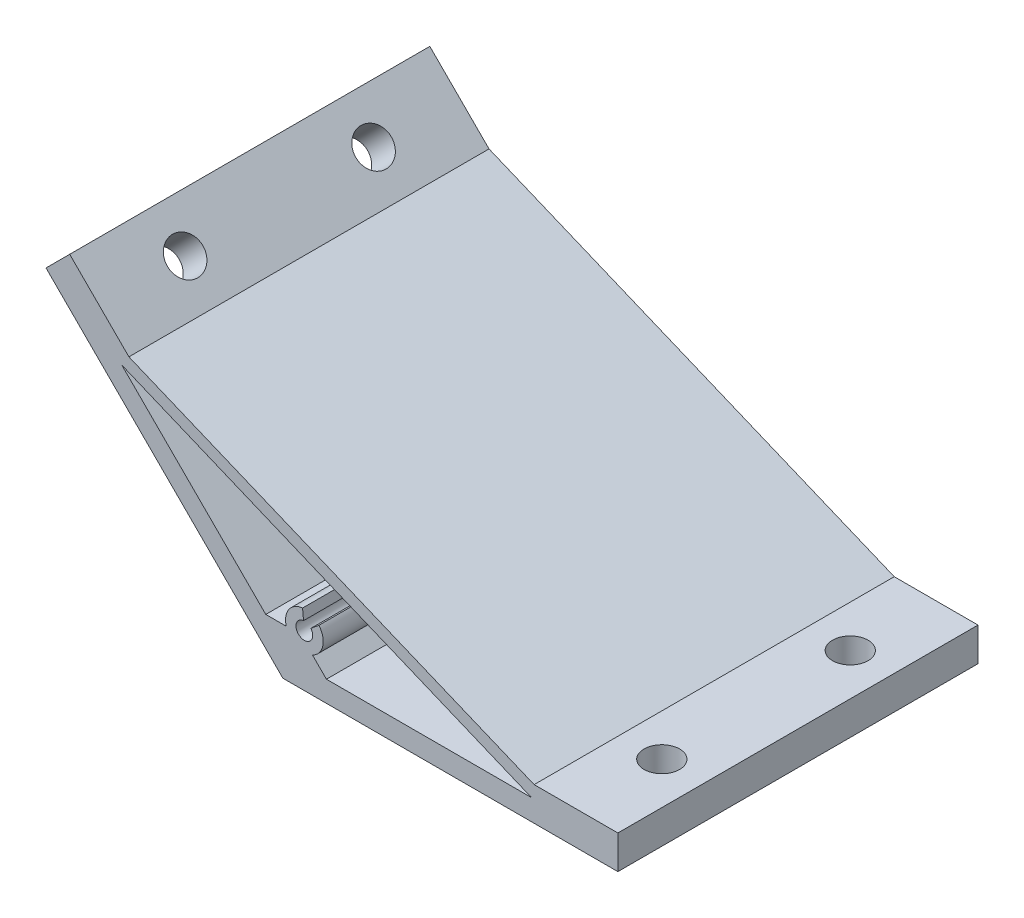
ISO-10303-21;
HEADER;
FILE_DESCRIPTION(('STEP AP214'),'2;1');
FILE_NAME('part.step','',(''),(''),'','','');
FILE_SCHEMA(('AUTOMOTIVE_DESIGN { 1 0 10303 214 1 1 1 1 }'));
ENDSEC;
DATA;
#1=APPLICATION_CONTEXT('core data for automotive mechanical design processes');
#2=APPLICATION_PROTOCOL_DEFINITION('international standard','automotive_design',2000,#1);
#3=PRODUCT_CONTEXT('',#1,'mechanical');
#4=PRODUCT('Part','Part','',(#3));
#5=PRODUCT_RELATED_PRODUCT_CATEGORY('part','',(#4));
#6=PRODUCT_DEFINITION_FORMATION('','',#4);
#7=PRODUCT_DEFINITION_CONTEXT('part definition',#1,'design');
#8=PRODUCT_DEFINITION('design','',#6,#7);
#9=PRODUCT_DEFINITION_SHAPE('','',#8);
#10=(LENGTH_UNIT() NAMED_UNIT(*) SI_UNIT(.MILLI.,.METRE.));
#11=(NAMED_UNIT(*) PLANE_ANGLE_UNIT() SI_UNIT($,.RADIAN.));
#12=(NAMED_UNIT(*) SI_UNIT($,.STERADIAN.) SOLID_ANGLE_UNIT());
#13=UNCERTAINTY_MEASURE_WITH_UNIT(LENGTH_MEASURE(1.E-05),#10,'distance_accuracy_value','');
#14=(GEOMETRIC_REPRESENTATION_CONTEXT(3) GLOBAL_UNCERTAINTY_ASSIGNED_CONTEXT((#13)) GLOBAL_UNIT_ASSIGNED_CONTEXT((#10,
#11,#12)) REPRESENTATION_CONTEXT('',''));
#15=CARTESIAN_POINT('',(0.,0.,0.));
#16=DIRECTION('',(0.,0.,1.));
#17=DIRECTION('',(1.,0.,0.));
#18=AXIS2_PLACEMENT_3D('',#15,#16,#17);
#19=CARTESIAN_POINT('',(580.06230191566,1400.39427630612,43.));
#20=DIRECTION('',(0.382683432365095,0.923879532511285,0.));
#21=DIRECTION('',(-0.923879532511285,0.382683432365095,0.));
#22=AXIS2_PLACEMENT_3D('',#19,#20,#21);
#23=PLANE('',#22);
#24=DIRECTION('',(0.923879532511285,-0.382683432365095,0.));
#25=VECTOR('',#24,1.);
#26=CARTESIAN_POINT('',(580.06230191566,1400.39427630612,-43.));
#27=LINE('',#26,#25);
#28=CARTESIAN_POINT('',(6955.91811216156,-1240.57167203307,-43.));
#29=VERTEX_POINT('',#28);
#30=CARTESIAN_POINT('',(7052.68766478326,-1280.65493315376,-43.));
#31=VERTEX_POINT('',#30);
#32=EDGE_CURVE('E233',#29,#31,#27,.T.);
#33=ORIENTED_EDGE('',*,*,#32,.F.);
#34=DIRECTION('',(0.,0.,-1.));
#35=VECTOR('',#34,1.);
#36=CARTESIAN_POINT('',(6955.91811216156,-1240.57167203307,43.));
#37=LINE('',#36,#35);
#38=CARTESIAN_POINT('',(6955.91811216156,-1240.57167203307,43.));
#39=VERTEX_POINT('',#38);
#40=EDGE_CURVE('E11',#39,#29,#37,.T.);
#41=ORIENTED_EDGE('',*,*,#40,.F.);
#42=DIRECTION('',(0.923879532511285,-0.382683432365095,0.));
#43=VECTOR('',#42,1.);
#44=CARTESIAN_POINT('',(580.06230191566,1400.39427630612,43.));
#45=LINE('',#44,#43);
#46=CARTESIAN_POINT('',(7052.68766478326,-1280.65493315376,43.));
#47=VERTEX_POINT('',#46);
#48=EDGE_CURVE('E270',#39,#47,#45,.T.);
#49=ORIENTED_EDGE('',*,*,#48,.T.);
#50=DIRECTION('',(0.,0.,-1.));
#51=VECTOR('',#50,1.);
#52=CARTESIAN_POINT('',(7052.68766478326,-1280.65493315376,43.));
#53=LINE('',#52,#51);
#54=EDGE_CURVE('E54',#47,#31,#53,.T.);
#55=ORIENTED_EDGE('',*,*,#54,.T.);
#56=EDGE_LOOP('',(#33,#41,#49,#55));
#57=FACE_BOUND('',#56,.T.);
#58=ADVANCED_FACE('F35',(#57),#23,.T.);
#59=CARTESIAN_POINT('',(2857.67322006435,2857.67322006426,43.));
#60=DIRECTION('',(-0.707106781186559,-0.707106781186536,0.));
#61=DIRECTION('',(0.707106781186536,-0.707106781186559,0.));
#62=AXIS2_PLACEMENT_3D('',#59,#60,#61);
#63=PLANE('',#62);
#64=CARTESIAN_POINT('',(6948.84704434969,-1233.50060422121,-22.5));
#65=DIRECTION('',(-0.707106781186559,-0.707106781186536,0.));
#66=DIRECTION('',(0.707106781186536,-0.707106781186559,0.));
#67=AXIS2_PLACEMENT_3D('',#64,#65,#66);
#68=CIRCLE('',#67,4.24999999999998);
#69=CARTESIAN_POINT('',(6951.85224816974,-1236.50580804125,-22.5));
#70=VERTEX_POINT('',#69);
#71=EDGE_CURVE('E299',#70,#70,#68,.T.);
#72=ORIENTED_EDGE('',*,*,#71,.T.);
#73=EDGE_LOOP('',(#72));
#74=FACE_BOUND('',#73,.T.);
#75=CARTESIAN_POINT('',(6948.84704434969,-1233.50060422121,22.5));
#76=DIRECTION('',(-0.707106781186559,-0.707106781186536,0.));
#77=DIRECTION('',(0.707106781186536,-0.707106781186559,0.));
#78=AXIS2_PLACEMENT_3D('',#75,#76,#77);
#79=CIRCLE('',#78,4.24999999999998);
#80=CARTESIAN_POINT('',(6951.85224816974,-1236.50580804125,22.5));
#81=VERTEX_POINT('',#80);
#82=EDGE_CURVE('E262',#81,#81,#79,.T.);
#83=ORIENTED_EDGE('',*,*,#82,.T.);
#84=EDGE_LOOP('',(#83));
#85=FACE_BOUND('',#84,.T.);
#86=DIRECTION('',(-0.707106781186536,0.707106781186559,0.));
#87=VECTOR('',#86,1.);
#88=CARTESIAN_POINT('',(2857.67322006435,2857.67322006426,-43.));
#89=LINE('',#88,#87);
#90=CARTESIAN_POINT('',(6941.77597653783,-1226.42953640934,-43.));
#91=VERTEX_POINT('',#90);
#92=EDGE_CURVE('E230',#29,#91,#89,.T.);
#93=ORIENTED_EDGE('',*,*,#92,.T.);
#94=DIRECTION('',(0.,0.,-1.));
#95=VECTOR('',#94,1.);
#96=CARTESIAN_POINT('',(6941.77597653783,-1226.42953640934,43.));
#97=LINE('',#96,#95);
#98=CARTESIAN_POINT('',(6941.77597653783,-1226.42953640934,43.));
#99=VERTEX_POINT('',#98);
#100=EDGE_CURVE('E45',#99,#91,#97,.T.);
#101=ORIENTED_EDGE('',*,*,#100,.F.);
#102=DIRECTION('',(-0.707106781186536,0.707106781186559,0.));
#103=VECTOR('',#102,1.);
#104=CARTESIAN_POINT('',(2857.67322006435,2857.67322006426,43.));
#105=LINE('',#104,#103);
#106=EDGE_CURVE('E268',#39,#99,#105,.T.);
#107=ORIENTED_EDGE('',*,*,#106,.F.);
#108=ORIENTED_EDGE('',*,*,#40,.T.);
#109=EDGE_LOOP('',(#93,#101,#107,#108));
#110=FACE_BOUND('',#109,.T.);
#111=ADVANCED_FACE('F332',(#74,#85,#110),#63,.F.);
#112=CARTESIAN_POINT('',(4084.10275647372,-4084.10275647356,43.));
#113=DIRECTION('',(-0.707106781186561,0.707106781186534,0.));
#114=DIRECTION('',(-0.707106781186534,-0.707106781186561,0.));
#115=AXIS2_PLACEMENT_3D('',#112,#113,#114);
#116=PLANE('',#115);
#117=DIRECTION('',(0.707106781186534,0.707106781186561,0.));
#118=VECTOR('',#117,1.);
#119=CARTESIAN_POINT('',(4084.10275647372,-4084.10275647356,-43.));
#120=LINE('',#119,#118);
#121=CARTESIAN_POINT('',(6936.11912228834,-1232.08639065884,-43.));
#122=VERTEX_POINT('',#121);
#123=EDGE_CURVE('E227',#122,#91,#120,.T.);
#124=ORIENTED_EDGE('',*,*,#123,.F.);
#125=DIRECTION('',(0.,0.,-1.));
#126=VECTOR('',#125,1.);
#127=CARTESIAN_POINT('',(6936.11912228834,-1232.08639065884,43.));
#128=LINE('',#127,#126);
#129=CARTESIAN_POINT('',(6936.11912228834,-1232.08639065884,43.));
#130=VERTEX_POINT('',#129);
#131=EDGE_CURVE('E187',#130,#122,#128,.T.);
#132=ORIENTED_EDGE('',*,*,#131,.F.);
#133=DIRECTION('',(0.707106781186534,0.707106781186561,0.));
#134=VECTOR('',#133,1.);
#135=CARTESIAN_POINT('',(4084.10275647372,-4084.10275647356,43.));
#136=LINE('',#135,#134);
#137=EDGE_CURVE('E265',#130,#99,#136,.T.);
#138=ORIENTED_EDGE('',*,*,#137,.T.);
#139=ORIENTED_EDGE('',*,*,#100,.T.);
#140=EDGE_LOOP('',(#124,#132,#138,#139));
#141=FACE_BOUND('',#140,.T.);
#142=ADVANCED_FACE('F338',(#141),#116,.T.);
#143=CARTESIAN_POINT('',(2852.0163658146,2852.01636581472,43.));
#144=DIRECTION('',(-0.707106781186532,-0.707106781186563,0.));
#145=DIRECTION('',(0.707106781186563,-0.707106781186532,0.));
#146=AXIS2_PLACEMENT_3D('',#143,#144,#145);
#147=PLANE('',#146);
#148=CARTESIAN_POINT('',(6943.1901901002,-1239.1574584707,-22.5));
#149=DIRECTION('',(-0.707106781186532,-0.707106781186563,0.));
#150=DIRECTION('',(0.707106781186563,-0.707106781186532,0.));
#151=AXIS2_PLACEMENT_3D('',#148,#149,#150);
#152=CIRCLE('',#151,4.24999999999999);
#153=CARTESIAN_POINT('',(6946.19539392024,-1242.16266229074,-22.5));
#154=VERTEX_POINT('',#153);
#155=EDGE_CURVE('E302',#154,#154,#152,.T.);
#156=ORIENTED_EDGE('',*,*,#155,.F.);
#157=EDGE_LOOP('',(#156));
#158=FACE_BOUND('',#157,.T.);
#159=CARTESIAN_POINT('',(6943.1901901002,-1239.1574584707,22.5));
#160=DIRECTION('',(-0.707106781186532,-0.707106781186563,0.));
#161=DIRECTION('',(0.707106781186563,-0.707106781186532,0.));
#162=AXIS2_PLACEMENT_3D('',#159,#160,#161);
#163=CIRCLE('',#162,4.24999999999999);
#164=CARTESIAN_POINT('',(6946.19539392024,-1242.16266229074,22.5));
#165=VERTEX_POINT('',#164);
#166=EDGE_CURVE('E296',#165,#165,#163,.T.);
#167=ORIENTED_EDGE('',*,*,#166,.F.);
#168=EDGE_LOOP('',(#167));
#169=FACE_BOUND('',#168,.T.);
#170=DIRECTION('',(-0.707106781186563,0.707106781186532,0.));
#171=VECTOR('',#170,1.);
#172=CARTESIAN_POINT('',(2852.0163658146,2852.01636581472,-43.));
#173=LINE('',#172,#171);
#174=CARTESIAN_POINT('',(6992.68766478326,-1288.65493315376,-43.));
#175=VERTEX_POINT('',#174);
#176=EDGE_CURVE('E224',#175,#122,#173,.T.);
#177=ORIENTED_EDGE('',*,*,#176,.F.);
#178=DIRECTION('',(0.,0.,-1.));
#179=VECTOR('',#178,1.);
#180=CARTESIAN_POINT('',(6992.68766478326,-1288.65493315376,43.));
#181=LINE('',#180,#179);
#182=CARTESIAN_POINT('',(6992.68766478326,-1288.65493315376,43.));
#183=VERTEX_POINT('',#182);
#184=EDGE_CURVE('E185',#183,#175,#181,.T.);
#185=ORIENTED_EDGE('',*,*,#184,.F.);
#186=DIRECTION('',(-0.707106781186563,0.707106781186532,0.));
#187=VECTOR('',#186,1.);
#188=CARTESIAN_POINT('',(2852.0163658146,2852.01636581472,43.));
#189=LINE('',#188,#187);
#190=EDGE_CURVE('E179',#183,#130,#189,.T.);
#191=ORIENTED_EDGE('',*,*,#190,.T.);
#192=ORIENTED_EDGE('',*,*,#131,.T.);
#193=EDGE_LOOP('',(#177,#185,#191,#192));
#194=FACE_BOUND('',#193,.T.);
#195=ADVANCED_FACE('F336',(#158,#169,#194),#147,.T.);
#196=CARTESIAN_POINT('',(0.,-1288.65493315376,43.));
#197=DIRECTION('',(0.,1.,0.));
#198=DIRECTION('',(0.,0.,1.));
#199=AXIS2_PLACEMENT_3D('',#196,#197,#198);
#200=PLANE('',#199);
#201=CARTESIAN_POINT('',(7062.68766478326,-1288.65493315377,-22.5));
#202=DIRECTION('',(0.,-1.,0.));
#203=DIRECTION('',(0.,0.,-1.));
#204=AXIS2_PLACEMENT_3D('',#201,#202,#203);
#205=CIRCLE('',#204,4.24999999999986);
#206=CARTESIAN_POINT('',(7062.68766478326,-1288.65493315377,-26.7499999999999));
#207=VERTEX_POINT('',#206);
#208=EDGE_CURVE('E311',#207,#207,#205,.T.);
#209=ORIENTED_EDGE('',*,*,#208,.F.);
#210=EDGE_LOOP('',(#209));
#211=FACE_BOUND('',#210,.T.);
#212=CARTESIAN_POINT('',(7062.68766478326,-1288.65493315377,22.5));
#213=DIRECTION('',(0.,-1.,0.));
#214=DIRECTION('',(0.,0.,-1.));
#215=AXIS2_PLACEMENT_3D('',#212,#213,#214);
#216=CIRCLE('',#215,4.24999999999986);
#217=CARTESIAN_POINT('',(7062.68766478326,-1288.65493315377,18.2500000000001));
#218=VERTEX_POINT('',#217);
#219=EDGE_CURVE('E308',#218,#218,#216,.T.);
#220=ORIENTED_EDGE('',*,*,#219,.F.);
#221=EDGE_LOOP('',(#220));
#222=FACE_BOUND('',#221,.T.);
#223=DIRECTION('',(1.,0.,0.));
#224=VECTOR('',#223,1.);
#225=CARTESIAN_POINT('',(0.,-1288.65493315376,-43.));
#226=LINE('',#225,#224);
#227=CARTESIAN_POINT('',(7072.68766478326,-1288.65493315376,-43.));
#228=VERTEX_POINT('',#227);
#229=EDGE_CURVE('E184',#175,#228,#226,.T.);
#230=ORIENTED_EDGE('',*,*,#229,.T.);
#231=DIRECTION('',(0.,0.,-1.));
#232=VECTOR('',#231,1.);
#233=CARTESIAN_POINT('',(7072.68766478326,-1288.65493315376,43.));
#234=LINE('',#233,#232);
#235=CARTESIAN_POINT('',(7072.68766478326,-1288.65493315376,43.));
#236=VERTEX_POINT('',#235);
#237=EDGE_CURVE('E166',#236,#228,#234,.T.);
#238=ORIENTED_EDGE('',*,*,#237,.F.);
#239=DIRECTION('',(1.,0.,0.));
#240=VECTOR('',#239,1.);
#241=CARTESIAN_POINT('',(0.,-1288.65493315376,43.));
#242=LINE('',#241,#240);
#243=EDGE_CURVE('E171',#183,#236,#242,.T.);
#244=ORIENTED_EDGE('',*,*,#243,.F.);
#245=ORIENTED_EDGE('',*,*,#184,.T.);
#246=EDGE_LOOP('',(#230,#238,#244,#245));
#247=FACE_BOUND('',#246,.T.);
#248=ADVANCED_FACE('F182',(#211,#222,#247),#200,.F.);
#249=CARTESIAN_POINT('',(7072.68766478326,0.,43.));
#250=DIRECTION('',(-1.,0.,0.));
#251=DIRECTION('',(0.,0.,1.));
#252=AXIS2_PLACEMENT_3D('',#249,#250,#251);
#253=PLANE('',#252);
#254=DIRECTION('',(0.,1.,0.));
#255=VECTOR('',#254,1.);
#256=CARTESIAN_POINT('',(7072.68766478326,0.,-43.));
#257=LINE('',#256,#255);
#258=CARTESIAN_POINT('',(7072.68766478326,-1280.65493315376,-43.));
#259=VERTEX_POINT('',#258);
#260=EDGE_CURVE('E221',#228,#259,#257,.T.);
#261=ORIENTED_EDGE('',*,*,#260,.T.);
#262=DIRECTION('',(0.,0.,-1.));
#263=VECTOR('',#262,1.);
#264=CARTESIAN_POINT('',(7072.68766478326,-1280.65493315376,43.));
#265=LINE('',#264,#263);
#266=CARTESIAN_POINT('',(7072.68766478326,-1280.65493315376,43.));
#267=VERTEX_POINT('',#266);
#268=EDGE_CURVE('E107',#267,#259,#265,.T.);
#269=ORIENTED_EDGE('',*,*,#268,.F.);
#270=DIRECTION('',(0.,1.,0.));
#271=VECTOR('',#270,1.);
#272=CARTESIAN_POINT('',(7072.68766478326,0.,43.));
#273=LINE('',#272,#271);
#274=EDGE_CURVE('E162',#236,#267,#273,.T.);
#275=ORIENTED_EDGE('',*,*,#274,.F.);
#276=ORIENTED_EDGE('',*,*,#237,.T.);
#277=EDGE_LOOP('',(#261,#269,#275,#276));
#278=FACE_BOUND('',#277,.T.);
#279=ADVANCED_FACE('F164',(#278),#253,.F.);
#280=CARTESIAN_POINT('',(6997.82073881189,-1276.26412007604,43.));
#281=DIRECTION('',(0.,0.,-1.));
#282=DIRECTION('',(-1.,0.,0.));
#283=AXIS2_PLACEMENT_3D('',#280,#281,#282);
#284=CYLINDRICAL_SURFACE('',#283,1.99999999999993);
#285=CARTESIAN_POINT('',(6997.82073881189,-1276.26412007604,-43.));
#286=DIRECTION('',(0.,0.,1.));
#287=DIRECTION('',(1.,0.,0.));
#288=AXIS2_PLACEMENT_3D('',#285,#286,#287);
#289=CIRCLE('',#288,1.99999999999993);
#290=CARTESIAN_POINT('',(6997.62653003943,-1274.27357167103,-43.));
#291=VERTEX_POINT('',#290);
#292=CARTESIAN_POINT('',(6999.36559542733,-1274.99391614055,-43.));
#293=VERTEX_POINT('',#292);
#294=EDGE_CURVE('E259',#291,#293,#289,.T.);
#295=ORIENTED_EDGE('',*,*,#294,.F.);
#296=DIRECTION('',(0.,0.,-1.));
#297=VECTOR('',#296,1.);
#298=CARTESIAN_POINT('',(6997.62653003943,-1274.27357167103,43.));
#299=LINE('',#298,#297);
#300=CARTESIAN_POINT('',(6997.62653003943,-1274.27357167103,43.));
#301=VERTEX_POINT('',#300);
#302=EDGE_CURVE('E119',#301,#291,#299,.T.);
#303=ORIENTED_EDGE('',*,*,#302,.F.);
#304=CARTESIAN_POINT('',(6997.82073881189,-1276.26412007604,43.));
#305=DIRECTION('',(0.,0.,1.));
#306=DIRECTION('',(1.,0.,0.));
#307=AXIS2_PLACEMENT_3D('',#304,#305,#306);
#308=CIRCLE('',#307,1.99999999999993);
#309=CARTESIAN_POINT('',(6999.36559542733,-1274.99391614055,43.));
#310=VERTEX_POINT('',#309);
#311=EDGE_CURVE('E220',#301,#310,#308,.T.);
#312=ORIENTED_EDGE('',*,*,#311,.T.);
#313=DIRECTION('',(0.,0.,-1.));
#314=VECTOR('',#313,1.);
#315=CARTESIAN_POINT('',(6999.36559542733,-1274.99391614055,43.));
#316=LINE('',#315,#314);
#317=EDGE_CURVE('E194',#310,#293,#316,.T.);
#318=ORIENTED_EDGE('',*,*,#317,.T.);
#319=EDGE_LOOP('',(#295,#303,#312,#318));
#320=FACE_BOUND('',#319,.T.);
#321=ADVANCED_FACE('F37',(#320),#284,.F.);
#322=CARTESIAN_POINT('',(6808.49128288336,664.273589646761,43.));
#323=DIRECTION('',(-0.9952742025064,-0.0971043862307417,0.));
#324=DIRECTION('',(0.0971043862307417,-0.9952742025064,0.));
#325=AXIS2_PLACEMENT_3D('',#322,#323,#324);
#326=PLANE('',#325);
#327=DIRECTION('',(-0.0971043862307417,0.9952742025064,0.));
#328=VECTOR('',#327,1.);
#329=CARTESIAN_POINT('',(6808.49128288336,664.273589646761,-43.));
#330=LINE('',#329,#328);
#331=CARTESIAN_POINT('',(6997.38376907385,-1271.78538616476,-43.));
#332=VERTEX_POINT('',#331);
#333=EDGE_CURVE('E257',#291,#332,#330,.T.);
#334=ORIENTED_EDGE('',*,*,#333,.T.);
#335=DIRECTION('',(0.,0.,-1.));
#336=VECTOR('',#335,1.);
#337=CARTESIAN_POINT('',(6997.38376907385,-1271.78538616476,43.));
#338=LINE('',#337,#336);
#339=CARTESIAN_POINT('',(6997.38376907385,-1271.78538616476,43.));
#340=VERTEX_POINT('',#339);
#341=EDGE_CURVE('E212',#340,#332,#338,.T.);
#342=ORIENTED_EDGE('',*,*,#341,.F.);
#343=DIRECTION('',(-0.0971043862307417,0.9952742025064,0.));
#344=VECTOR('',#343,1.);
#345=CARTESIAN_POINT('',(6808.49128288336,664.273589646761,43.));
#346=LINE('',#345,#344);
#347=EDGE_CURVE('E291',#301,#340,#346,.T.);
#348=ORIENTED_EDGE('',*,*,#347,.F.);
#349=ORIENTED_EDGE('',*,*,#302,.T.);
#350=EDGE_LOOP('',(#334,#342,#348,#349));
#351=FACE_BOUND('',#350,.T.);
#352=ADVANCED_FACE('F383',(#351),#326,.F.);
#353=CARTESIAN_POINT('',(6997.82073881189,-1276.26412007604,43.));
#354=DIRECTION('',(0.,0.,-1.));
#355=DIRECTION('',(-1.,0.,0.));
#356=AXIS2_PLACEMENT_3D('',#353,#354,#355);
#357=CYLINDRICAL_SURFACE('',#356,4.49999999999951);
#358=CARTESIAN_POINT('',(6997.82073881189,-1276.26412007604,-43.));
#359=DIRECTION('',(0.,0.,1.));
#360=DIRECTION('',(1.,0.,0.));
#361=AXIS2_PLACEMENT_3D('',#358,#359,#360);
#362=CIRCLE('',#361,4.49999999999951);
#363=CARTESIAN_POINT('',(6993.49338103034,-1277.49861374974,-43.));
#364=VERTEX_POINT('',#363);
#365=EDGE_CURVE('E254',#332,#364,#362,.T.);
#366=ORIENTED_EDGE('',*,*,#365,.T.);
#367=DIRECTION('',(0.,0.,-1.));
#368=VECTOR('',#367,1.);
#369=CARTESIAN_POINT('',(6993.49338103034,-1277.49861374974,43.));
#370=LINE('',#369,#368);
#371=CARTESIAN_POINT('',(6993.49338103034,-1277.49861374974,43.));
#372=VERTEX_POINT('',#371);
#373=EDGE_CURVE('E210',#372,#364,#370,.T.);
#374=ORIENTED_EDGE('',*,*,#373,.F.);
#375=CARTESIAN_POINT('',(6997.82073881189,-1276.26412007604,43.));
#376=DIRECTION('',(0.,0.,1.));
#377=DIRECTION('',(1.,0.,0.));
#378=AXIS2_PLACEMENT_3D('',#375,#376,#377);
#379=CIRCLE('',#378,4.49999999999951);
#380=EDGE_CURVE('E289',#340,#372,#379,.T.);
#381=ORIENTED_EDGE('',*,*,#380,.F.);
#382=ORIENTED_EDGE('',*,*,#341,.T.);
#383=EDGE_LOOP('',(#366,#374,#381,#382));
#384=FACE_BOUND('',#383,.T.);
#385=ADVANCED_FACE('F380',(#384),#357,.T.);
#386=CARTESIAN_POINT('',(1.15994087185971E-09,-1277.49861375609,43.));
#387=DIRECTION('',(-9.079781843749E-13,1.,0.));
#388=DIRECTION('',(-1.,-9.079781843749E-13,0.));
#389=AXIS2_PLACEMENT_3D('',#386,#387,#388);
#390=PLANE('',#389);
#391=DIRECTION('',(1.,9.079781843749E-13,0.));
#392=VECTOR('',#391,1.);
#393=CARTESIAN_POINT('',(1.15994087185971E-09,-1277.49861375609,-43.));
#394=LINE('',#393,#392);
#395=CARTESIAN_POINT('',(6988.60241319111,-1277.49861374974,-43.));
#396=VERTEX_POINT('',#395);
#397=EDGE_CURVE('E251',#396,#364,#394,.T.);
#398=ORIENTED_EDGE('',*,*,#397,.F.);
#399=DIRECTION('',(0.,0.,-1.));
#400=VECTOR('',#399,1.);
#401=CARTESIAN_POINT('',(6988.60241319111,-1277.49861374974,43.));
#402=LINE('',#401,#400);
#403=CARTESIAN_POINT('',(6988.60241319111,-1277.49861374974,43.));
#404=VERTEX_POINT('',#403);
#405=EDGE_CURVE('E208',#404,#396,#402,.T.);
#406=ORIENTED_EDGE('',*,*,#405,.F.);
#407=DIRECTION('',(1.,9.079781843749E-13,0.));
#408=VECTOR('',#407,1.);
#409=CARTESIAN_POINT('',(1.15994087185971E-09,-1277.49861375609,43.));
#410=LINE('',#409,#408);
#411=EDGE_CURVE('E286',#404,#372,#410,.T.);
#412=ORIENTED_EDGE('',*,*,#411,.T.);
#413=ORIENTED_EDGE('',*,*,#373,.T.);
#414=EDGE_LOOP('',(#398,#406,#412,#413));
#415=FACE_BOUND('',#414,.T.);
#416=ADVANCED_FACE('F376',(#415),#390,.T.);
#417=CARTESIAN_POINT('',(2855.55189972073,2855.55189972069,43.));
#418=DIRECTION('',(-0.707106781186552,-0.707106781186543,0.));
#419=DIRECTION('',(0.707106781186543,-0.707106781186552,0.));
#420=AXIS2_PLACEMENT_3D('',#417,#418,#419);
#421=PLANE('',#420);
#422=DIRECTION('',(-0.707106781186543,0.707106781186552,0.));
#423=VECTOR('',#422,1.);
#424=CARTESIAN_POINT('',(2855.55189972073,2855.55189972069,-43.));
#425=LINE('',#424,#423);
#426=CARTESIAN_POINT('',(6954.21874866951,-1243.11494922814,-43.));
#427=VERTEX_POINT('',#426);
#428=EDGE_CURVE('E249',#396,#427,#425,.T.);
#429=ORIENTED_EDGE('',*,*,#428,.T.);
#430=DIRECTION('',(0.,0.,-1.));
#431=VECTOR('',#430,1.);
#432=CARTESIAN_POINT('',(6954.21874866951,-1243.11494922814,43.));
#433=LINE('',#432,#431);
#434=CARTESIAN_POINT('',(6954.21874866951,-1243.11494922814,43.));
#435=VERTEX_POINT('',#434);
#436=EDGE_CURVE('E205',#435,#427,#433,.T.);
#437=ORIENTED_EDGE('',*,*,#436,.F.);
#438=DIRECTION('',(-0.707106781186543,0.707106781186552,0.));
#439=VECTOR('',#438,1.);
#440=CARTESIAN_POINT('',(2855.55189972073,2855.55189972069,43.));
#441=LINE('',#440,#439);
#442=EDGE_CURVE('E284',#404,#435,#441,.T.);
#443=ORIENTED_EDGE('',*,*,#442,.F.);
#444=ORIENTED_EDGE('',*,*,#405,.T.);
#445=EDGE_LOOP('',(#429,#437,#443,#444));
#446=FACE_BOUND('',#445,.T.);
#447=ADVANCED_FACE('F372',(#446),#421,.F.);
#448=CARTESIAN_POINT('',(578.914251618586,1397.62263770862,43.));
#449=DIRECTION('',(0.3826834323651,0.923879532511283,0.));
#450=DIRECTION('',(-0.923879532511283,0.3826834323651,0.));
#451=AXIS2_PLACEMENT_3D('',#448,#449,#450);
#452=PLANE('',#451);
#453=DIRECTION('',(0.923879532511283,-0.3826834323651,0.));
#454=VECTOR('',#453,1.);
#455=CARTESIAN_POINT('',(578.914251618586,1397.62263770862,-43.));
#456=LINE('',#455,#454);
#457=CARTESIAN_POINT('',(7052.09092768112,-1283.65493315376,-43.));
#458=VERTEX_POINT('',#457);
#459=EDGE_CURVE('E246',#427,#458,#456,.T.);
#460=ORIENTED_EDGE('',*,*,#459,.T.);
#461=DIRECTION('',(0.,0.,-1.));
#462=VECTOR('',#461,1.);
#463=CARTESIAN_POINT('',(7052.09092768112,-1283.65493315376,43.));
#464=LINE('',#463,#462);
#465=CARTESIAN_POINT('',(7052.09092768112,-1283.65493315376,43.));
#466=VERTEX_POINT('',#465);
#467=EDGE_CURVE('E203',#466,#458,#464,.T.);
#468=ORIENTED_EDGE('',*,*,#467,.F.);
#469=DIRECTION('',(0.923879532511283,-0.3826834323651,0.));
#470=VECTOR('',#469,1.);
#471=CARTESIAN_POINT('',(578.914251618586,1397.62263770862,43.));
#472=LINE('',#471,#470);
#473=EDGE_CURVE('E282',#435,#466,#472,.T.);
#474=ORIENTED_EDGE('',*,*,#473,.F.);
#475=ORIENTED_EDGE('',*,*,#436,.T.);
#476=EDGE_LOOP('',(#460,#468,#474,#475));
#477=FACE_BOUND('',#476,.T.);
#478=ADVANCED_FACE('F368',(#477),#452,.F.);
#479=CARTESIAN_POINT('',(-5.8169112753506E-12,-1283.65493315373,43.));
#480=DIRECTION('',(0.,1.,0.));
#481=DIRECTION('',(-1.,0.,0.));
#482=AXIS2_PLACEMENT_3D('',#479,#480,#481);
#483=PLANE('',#482);
#484=DIRECTION('',(1.,0.,0.));
#485=VECTOR('',#484,1.);
#486=CARTESIAN_POINT('',(-5.8169112753506E-12,-1283.65493315373,-43.));
#487=LINE('',#486,#485);
#488=CARTESIAN_POINT('',(7003.09092768112,-1283.65493315376,-43.));
#489=VERTEX_POINT('',#488);
#490=EDGE_CURVE('E243',#489,#458,#487,.T.);
#491=ORIENTED_EDGE('',*,*,#490,.F.);
#492=DIRECTION('',(0.,0.,-1.));
#493=VECTOR('',#492,1.);
#494=CARTESIAN_POINT('',(7003.09092768112,-1283.65493315376,43.));
#495=LINE('',#494,#493);
#496=CARTESIAN_POINT('',(7003.09092768112,-1283.65493315376,43.));
#497=VERTEX_POINT('',#496);
#498=EDGE_CURVE('E201',#497,#489,#495,.T.);
#499=ORIENTED_EDGE('',*,*,#498,.F.);
#500=DIRECTION('',(1.,0.,0.));
#501=VECTOR('',#500,1.);
#502=CARTESIAN_POINT('',(-5.8169112753506E-12,-1283.65493315373,43.));
#503=LINE('',#502,#501);
#504=EDGE_CURVE('E279',#497,#466,#503,.T.);
#505=ORIENTED_EDGE('',*,*,#504,.T.);
#506=ORIENTED_EDGE('',*,*,#467,.T.);
#507=EDGE_LOOP('',(#491,#499,#505,#506));
#508=FACE_BOUND('',#507,.T.);
#509=ADVANCED_FACE('F364',(#508),#483,.T.);
#510=CARTESIAN_POINT('',(2859.71799726508,2859.71799726394,43.));
#511=DIRECTION('',(-0.707106781186689,-0.707106781186406,0.));
#512=DIRECTION('',(0.707106781186406,-0.707106781186689,0.));
#513=AXIS2_PLACEMENT_3D('',#510,#511,#512);
#514=PLANE('',#513);
#515=DIRECTION('',(-0.707106781186406,0.707106781186689,0.));
#516=VECTOR('',#515,1.);
#517=CARTESIAN_POINT('',(2859.71799726508,2859.71799726394,-43.));
#518=LINE('',#517,#516);
#519=CARTESIAN_POINT('',(6999.76054974539,-1280.32455521803,-43.));
#520=VERTEX_POINT('',#519);
#521=EDGE_CURVE('E241',#489,#520,#518,.T.);
#522=ORIENTED_EDGE('',*,*,#521,.T.);
#523=DIRECTION('',(0.,0.,-1.));
#524=VECTOR('',#523,1.);
#525=CARTESIAN_POINT('',(6999.76054974539,-1280.32455521803,43.));
#526=LINE('',#525,#524);
#527=CARTESIAN_POINT('',(6999.76054974539,-1280.32455521803,43.));
#528=VERTEX_POINT('',#527);
#529=EDGE_CURVE('E198',#528,#520,#526,.T.);
#530=ORIENTED_EDGE('',*,*,#529,.F.);
#531=DIRECTION('',(-0.707106781186406,0.707106781186689,0.));
#532=VECTOR('',#531,1.);
#533=CARTESIAN_POINT('',(2859.71799726508,2859.71799726394,43.));
#534=LINE('',#533,#532);
#535=EDGE_CURVE('E277',#497,#528,#534,.T.);
#536=ORIENTED_EDGE('',*,*,#535,.F.);
#537=ORIENTED_EDGE('',*,*,#498,.T.);
#538=EDGE_LOOP('',(#522,#530,#536,#537));
#539=FACE_BOUND('',#538,.T.);
#540=ADVANCED_FACE('F360',(#539),#514,.F.);
#541=CARTESIAN_POINT('',(6997.82073881189,-1276.26412007604,43.));
#542=DIRECTION('',(0.,0.,-1.));
#543=DIRECTION('',(-1.,0.,0.));
#544=AXIS2_PLACEMENT_3D('',#541,#542,#543);
#545=CYLINDRICAL_SURFACE('',#544,4.50000000000019);
#546=CARTESIAN_POINT('',(6997.82073881189,-1276.26412007604,-43.));
#547=DIRECTION('',(0.,0.,1.));
#548=DIRECTION('',(1.,0.,0.));
#549=AXIS2_PLACEMENT_3D('',#546,#547,#548);
#550=CIRCLE('',#549,4.50000000000019);
#551=CARTESIAN_POINT('',(7001.29666619663,-1273.40616122119,-43.));
#552=VERTEX_POINT('',#551);
#553=EDGE_CURVE('E238',#520,#552,#550,.T.);
#554=ORIENTED_EDGE('',*,*,#553,.T.);
#555=DIRECTION('',(0.,0.,-1.));
#556=VECTOR('',#555,1.);
#557=CARTESIAN_POINT('',(7001.29666619663,-1273.40616122119,43.));
#558=LINE('',#557,#556);
#559=CARTESIAN_POINT('',(7001.29666619663,-1273.40616122119,43.));
#560=VERTEX_POINT('',#559);
#561=EDGE_CURVE('E196',#560,#552,#558,.T.);
#562=ORIENTED_EDGE('',*,*,#561,.F.);
#563=CARTESIAN_POINT('',(6997.82073881189,-1276.26412007604,43.));
#564=DIRECTION('',(0.,0.,1.));
#565=DIRECTION('',(1.,0.,0.));
#566=AXIS2_PLACEMENT_3D('',#563,#564,#565);
#567=CIRCLE('',#566,4.50000000000019);
#568=EDGE_CURVE('E275',#528,#560,#567,.T.);
#569=ORIENTED_EDGE('',*,*,#568,.F.);
#570=ORIENTED_EDGE('',*,*,#529,.T.);
#571=EDGE_LOOP('',(#554,#562,#569,#570));
#572=FACE_BOUND('',#571,.T.);
#573=ADVANCED_FACE('F356',(#572),#545,.T.);
#574=CARTESIAN_POINT('',(3448.70038270471,-4194.40331746767,43.));
#575=DIRECTION('',(-0.63510196774562,0.772428307719002,0.));
#576=DIRECTION('',(-0.772428307719002,-0.63510196774562,0.));
#577=AXIS2_PLACEMENT_3D('',#574,#575,#576);
#578=PLANE('',#577);
#579=DIRECTION('',(0.772428307719002,0.63510196774562,0.));
#580=VECTOR('',#579,1.);
#581=CARTESIAN_POINT('',(3448.70038270471,-4194.40331746767,-43.));
#582=LINE('',#581,#580);
#583=EDGE_CURVE('E235',#293,#552,#582,.T.);
#584=ORIENTED_EDGE('',*,*,#583,.F.);
#585=ORIENTED_EDGE('',*,*,#317,.F.);
#586=DIRECTION('',(0.772428307719002,0.63510196774562,0.));
#587=VECTOR('',#586,1.);
#588=CARTESIAN_POINT('',(3448.70038270471,-4194.40331746767,43.));
#589=LINE('',#588,#587);
#590=EDGE_CURVE('E272',#310,#560,#589,.T.);
#591=ORIENTED_EDGE('',*,*,#590,.T.);
#592=ORIENTED_EDGE('',*,*,#561,.T.);
#593=EDGE_LOOP('',(#584,#585,#591,#592));
#594=FACE_BOUND('',#593,.T.);
#595=ADVANCED_FACE('F323',(#594),#578,.T.);
#596=CARTESIAN_POINT('',(0.,-1280.65493315376,43.));
#597=DIRECTION('',(0.,1.,0.));
#598=DIRECTION('',(0.,0.,1.));
#599=AXIS2_PLACEMENT_3D('',#596,#597,#598);
#600=PLANE('',#599);
#601=CARTESIAN_POINT('',(7062.68766478326,-1280.65493315376,-22.5));
#602=DIRECTION('',(0.,1.,0.));
#603=DIRECTION('',(0.,0.,1.));
#604=AXIS2_PLACEMENT_3D('',#601,#602,#603);
#605=CIRCLE('',#604,4.24999999999986);
#606=CARTESIAN_POINT('',(7062.68766478326,-1280.65493315376,-18.2500000000001));
#607=VERTEX_POINT('',#606);
#608=EDGE_CURVE('E39',#607,#607,#605,.T.);
#609=ORIENTED_EDGE('',*,*,#608,.F.);
#610=EDGE_LOOP('',(#609));
#611=FACE_BOUND('',#610,.T.);
#612=CARTESIAN_POINT('',(7062.68766478326,-1280.65493315376,22.5));
#613=DIRECTION('',(0.,1.,0.));
#614=DIRECTION('',(0.,0.,1.));
#615=AXIS2_PLACEMENT_3D('',#612,#613,#614);
#616=CIRCLE('',#615,4.24999999999986);
#617=CARTESIAN_POINT('',(7062.68766478326,-1280.65493315376,26.7499999999999));
#618=VERTEX_POINT('',#617);
#619=EDGE_CURVE('E305',#618,#618,#616,.T.);
#620=ORIENTED_EDGE('',*,*,#619,.F.);
#621=EDGE_LOOP('',(#620));
#622=FACE_BOUND('',#621,.T.);
#623=DIRECTION('',(1.,0.,0.));
#624=VECTOR('',#623,1.);
#625=CARTESIAN_POINT('',(0.,-1280.65493315376,-43.));
#626=LINE('',#625,#624);
#627=EDGE_CURVE('E217',#31,#259,#626,.T.);
#628=ORIENTED_EDGE('',*,*,#627,.F.);
#629=ORIENTED_EDGE('',*,*,#54,.F.);
#630=DIRECTION('',(1.,0.,0.));
#631=VECTOR('',#630,1.);
#632=CARTESIAN_POINT('',(0.,-1280.65493315376,43.));
#633=LINE('',#632,#631);
#634=EDGE_CURVE('E170',#47,#267,#633,.T.);
#635=ORIENTED_EDGE('',*,*,#634,.T.);
#636=ORIENTED_EDGE('',*,*,#268,.T.);
#637=EDGE_LOOP('',(#628,#629,#635,#636));
#638=FACE_BOUND('',#637,.T.);
#639=ADVANCED_FACE('F320',(#611,#622,#638),#600,.T.);
#640=CARTESIAN_POINT('',(0.,0.,43.));
#641=DIRECTION('',(0.,0.,1.));
#642=DIRECTION('',(1.,0.,0.));
#643=AXIS2_PLACEMENT_3D('',#640,#641,#642);
#644=PLANE('',#643);
#645=ORIENTED_EDGE('',*,*,#311,.F.);
#646=ORIENTED_EDGE('',*,*,#347,.T.);
#647=ORIENTED_EDGE('',*,*,#380,.T.);
#648=ORIENTED_EDGE('',*,*,#411,.F.);
#649=ORIENTED_EDGE('',*,*,#442,.T.);
#650=ORIENTED_EDGE('',*,*,#473,.T.);
#651=ORIENTED_EDGE('',*,*,#504,.F.);
#652=ORIENTED_EDGE('',*,*,#535,.T.);
#653=ORIENTED_EDGE('',*,*,#568,.T.);
#654=ORIENTED_EDGE('',*,*,#590,.F.);
#655=EDGE_LOOP('',(#645,#646,#647,#648,#649,#650,#651,#652,#653,#654));
#656=FACE_BOUND('',#655,.T.);
#657=ORIENTED_EDGE('',*,*,#48,.F.);
#658=ORIENTED_EDGE('',*,*,#106,.T.);
#659=ORIENTED_EDGE('',*,*,#137,.F.);
#660=ORIENTED_EDGE('',*,*,#190,.F.);
#661=ORIENTED_EDGE('',*,*,#243,.T.);
#662=ORIENTED_EDGE('',*,*,#274,.T.);
#663=ORIENTED_EDGE('',*,*,#634,.F.);
#664=EDGE_LOOP('',(#657,#658,#659,#660,#661,#662,#663));
#665=FACE_BOUND('',#664,.T.);
#666=ADVANCED_FACE('F176',(#656,#665),#644,.T.);
#667=CARTESIAN_POINT('',(0.,0.,-43.));
#668=DIRECTION('',(0.,0.,1.));
#669=DIRECTION('',(1.,0.,0.));
#670=AXIS2_PLACEMENT_3D('',#667,#668,#669);
#671=PLANE('',#670);
#672=ORIENTED_EDGE('',*,*,#294,.T.);
#673=ORIENTED_EDGE('',*,*,#583,.T.);
#674=ORIENTED_EDGE('',*,*,#553,.F.);
#675=ORIENTED_EDGE('',*,*,#521,.F.);
#676=ORIENTED_EDGE('',*,*,#490,.T.);
#677=ORIENTED_EDGE('',*,*,#459,.F.);
#678=ORIENTED_EDGE('',*,*,#428,.F.);
#679=ORIENTED_EDGE('',*,*,#397,.T.);
#680=ORIENTED_EDGE('',*,*,#365,.F.);
#681=ORIENTED_EDGE('',*,*,#333,.F.);
#682=EDGE_LOOP('',(#672,#673,#674,#675,#676,#677,#678,#679,#680,#681));
#683=FACE_BOUND('',#682,.T.);
#684=ORIENTED_EDGE('',*,*,#32,.T.);
#685=ORIENTED_EDGE('',*,*,#627,.T.);
#686=ORIENTED_EDGE('',*,*,#260,.F.);
#687=ORIENTED_EDGE('',*,*,#229,.F.);
#688=ORIENTED_EDGE('',*,*,#176,.T.);
#689=ORIENTED_EDGE('',*,*,#123,.T.);
#690=ORIENTED_EDGE('',*,*,#92,.F.);
#691=EDGE_LOOP('',(#684,#685,#686,#687,#688,#689,#690));
#692=FACE_BOUND('',#691,.T.);
#693=ADVANCED_FACE('F327',(#683,#692),#671,.F.);
#694=CARTESIAN_POINT('',(6943.1901901002,-1239.1574584707,22.5));
#695=DIRECTION('',(-0.707106781186532,-0.707106781186563,0.));
#696=DIRECTION('',(0.707106781186563,-0.707106781186532,0.));
#697=AXIS2_PLACEMENT_3D('',#694,#695,#696);
#698=CYLINDRICAL_SURFACE('',#697,4.24999999999998);
#699=ORIENTED_EDGE('',*,*,#166,.T.);
#700=EDGE_LOOP('',(#699));
#701=FACE_BOUND('',#700,.T.);
#702=ORIENTED_EDGE('',*,*,#82,.F.);
#703=EDGE_LOOP('',(#702));
#704=FACE_BOUND('',#703,.T.);
#705=ADVANCED_FACE('F419',(#701,#704),#698,.F.);
#706=CARTESIAN_POINT('',(6943.1901901002,-1239.1574584707,-22.5));
#707=DIRECTION('',(-0.707106781186532,-0.707106781186563,0.));
#708=DIRECTION('',(0.707106781186563,-0.707106781186532,0.));
#709=AXIS2_PLACEMENT_3D('',#706,#707,#708);
#710=CYLINDRICAL_SURFACE('',#709,4.24999999999998);
#711=ORIENTED_EDGE('',*,*,#155,.T.);
#712=EDGE_LOOP('',(#711));
#713=FACE_BOUND('',#712,.T.);
#714=ORIENTED_EDGE('',*,*,#71,.F.);
#715=EDGE_LOOP('',(#714));
#716=FACE_BOUND('',#715,.T.);
#717=ADVANCED_FACE('F435',(#713,#716),#710,.F.);
#718=CARTESIAN_POINT('',(7062.68766478326,-1288.65493315377,22.5));
#719=DIRECTION('',(0.,-1.,0.));
#720=DIRECTION('',(0.,0.,-1.));
#721=AXIS2_PLACEMENT_3D('',#718,#719,#720);
#722=CYLINDRICAL_SURFACE('',#721,4.24999999999986);
#723=ORIENTED_EDGE('',*,*,#619,.T.);
#724=EDGE_LOOP('',(#723));
#725=FACE_BOUND('',#724,.T.);
#726=ORIENTED_EDGE('',*,*,#219,.T.);
#727=EDGE_LOOP('',(#726));
#728=FACE_BOUND('',#727,.T.);
#729=ADVANCED_FACE('F433',(#725,#728),#722,.F.);
#730=CARTESIAN_POINT('',(7062.68766478326,-1288.65493315377,-22.5));
#731=DIRECTION('',(0.,-1.,0.));
#732=DIRECTION('',(0.,0.,-1.));
#733=AXIS2_PLACEMENT_3D('',#730,#731,#732);
#734=CYLINDRICAL_SURFACE('',#733,4.24999999999986);
#735=ORIENTED_EDGE('',*,*,#608,.T.);
#736=EDGE_LOOP('',(#735));
#737=FACE_BOUND('',#736,.T.);
#738=ORIENTED_EDGE('',*,*,#208,.T.);
#739=EDGE_LOOP('',(#738));
#740=FACE_BOUND('',#739,.T.);
#741=ADVANCED_FACE('F318',(#737,#740),#734,.F.);
#742=CLOSED_SHELL('',(#58,#111,#142,#195,#248,#279,#321,#352,#385,#416,#447,#478,#509,#540,#573,
#595,#639,#666,#693,#705,#717,#729,#741));
#743=MANIFOLD_SOLID_BREP('B2',#742);
#744=ADVANCED_BREP_SHAPE_REPRESENTATION('',(#18,#743),#14);
#745=SHAPE_DEFINITION_REPRESENTATION(#9,#744);
ENDSEC;
END-ISO-10303-21;
